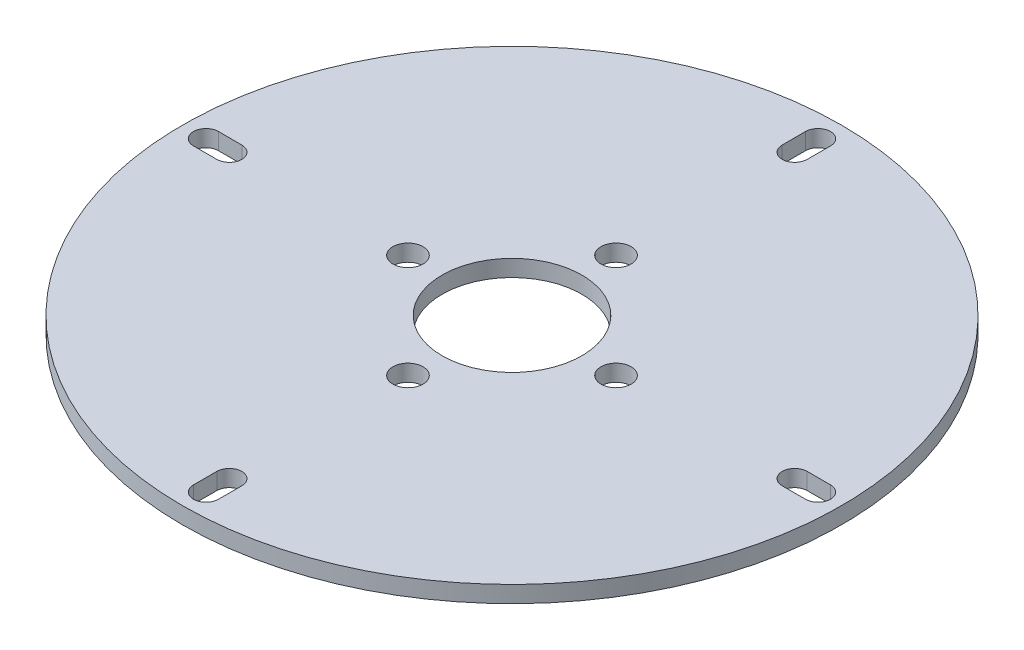
ISO-10303-21;
HEADER;
FILE_DESCRIPTION(('STEP AP214'),'2;1');
FILE_NAME('part.step','',(''),(''),'','','');
FILE_SCHEMA(('AUTOMOTIVE_DESIGN { 1 0 10303 214 1 1 1 1 }'));
ENDSEC;
DATA;
#1=APPLICATION_CONTEXT('core data for automotive mechanical design processes');
#2=APPLICATION_PROTOCOL_DEFINITION('international standard','automotive_design',2000,#1);
#3=PRODUCT_CONTEXT('',#1,'mechanical');
#4=PRODUCT('Part','Part','',(#3));
#5=PRODUCT_RELATED_PRODUCT_CATEGORY('part','',(#4));
#6=PRODUCT_DEFINITION_FORMATION('','',#4);
#7=PRODUCT_DEFINITION_CONTEXT('part definition',#1,'design');
#8=PRODUCT_DEFINITION('design','',#6,#7);
#9=PRODUCT_DEFINITION_SHAPE('','',#8);
#10=(LENGTH_UNIT() NAMED_UNIT(*) SI_UNIT(.MILLI.,.METRE.));
#11=(NAMED_UNIT(*) PLANE_ANGLE_UNIT() SI_UNIT($,.RADIAN.));
#12=(NAMED_UNIT(*) SI_UNIT($,.STERADIAN.) SOLID_ANGLE_UNIT());
#13=UNCERTAINTY_MEASURE_WITH_UNIT(LENGTH_MEASURE(1.E-05),#10,'distance_accuracy_value','');
#14=(GEOMETRIC_REPRESENTATION_CONTEXT(3) GLOBAL_UNCERTAINTY_ASSIGNED_CONTEXT((#13)) GLOBAL_UNIT_ASSIGNED_CONTEXT((#10,
#11,#12)) REPRESENTATION_CONTEXT('',''));
#15=CARTESIAN_POINT('',(0.,0.,0.));
#16=DIRECTION('',(0.,0.,1.));
#17=DIRECTION('',(1.,0.,0.));
#18=AXIS2_PLACEMENT_3D('',#15,#16,#17);
#19=CARTESIAN_POINT('',(0.,6.35,0.));
#20=DIRECTION('',(0.,-1.,0.));
#21=DIRECTION('',(0.,0.,-1.));
#22=AXIS2_PLACEMENT_3D('',#19,#20,#21);
#23=CYLINDRICAL_SURFACE('',#22,125.73);
#24=CARTESIAN_POINT('',(0.,6.35,0.));
#25=DIRECTION('',(0.,1.,0.));
#26=DIRECTION('',(0.,0.,1.));
#27=AXIS2_PLACEMENT_3D('',#24,#25,#26);
#28=CIRCLE('',#27,125.73);
#29=CARTESIAN_POINT('',(0.,6.35,125.73));
#30=VERTEX_POINT('',#29);
#31=EDGE_CURVE('E11',#30,#30,#28,.T.);
#32=ORIENTED_EDGE('',*,*,#31,.F.);
#33=EDGE_LOOP('',(#32));
#34=FACE_BOUND('',#33,.T.);
#35=CARTESIAN_POINT('',(0.,0.,0.));
#36=DIRECTION('',(0.,1.,0.));
#37=DIRECTION('',(0.,0.,1.));
#38=AXIS2_PLACEMENT_3D('',#35,#36,#37);
#39=CIRCLE('',#38,125.73);
#40=CARTESIAN_POINT('',(0.,0.,125.73));
#41=VERTEX_POINT('',#40);
#42=EDGE_CURVE('E48',#41,#41,#39,.T.);
#43=ORIENTED_EDGE('',*,*,#42,.T.);
#44=EDGE_LOOP('',(#43));
#45=FACE_BOUND('',#44,.T.);
#46=ADVANCED_FACE('F45',(#34,#45),#23,.T.);
#47=CARTESIAN_POINT('',(0.,6.35,0.));
#48=DIRECTION('',(0.,1.,0.));
#49=DIRECTION('',(0.,0.,1.));
#50=AXIS2_PLACEMENT_3D('',#47,#48,#49);
#51=PLANE('',#50);
#52=CARTESIAN_POINT('',(4.92454214481776E-05,6.35,39.6874999999886));
#53=DIRECTION('',(0.,1.,0.));
#54=DIRECTION('',(0.,0.,1.));
#55=AXIS2_PLACEMENT_3D('',#52,#53,#54);
#56=CIRCLE('',#55,5.7546875);
#57=CARTESIAN_POINT('',(4.92454214481776E-05,6.35,45.4421874999886));
#58=VERTEX_POINT('',#57);
#59=EDGE_CURVE('E309',#58,#58,#56,.T.);
#60=ORIENTED_EDGE('',*,*,#59,.F.);
#61=EDGE_LOOP('',(#60));
#62=FACE_BOUND('',#61,.T.);
#63=CARTESIAN_POINT('',(39.6875492454215,6.35,-1.09915874145494E-11));
#64=DIRECTION('',(0.,1.,0.));
#65=DIRECTION('',(0.,0.,1.));
#66=AXIS2_PLACEMENT_3D('',#63,#64,#65);
#67=CIRCLE('',#66,5.7546875);
#68=CARTESIAN_POINT('',(39.6875492454215,6.35,5.75468749998901));
#69=VERTEX_POINT('',#68);
#70=EDGE_CURVE('E300',#69,#69,#67,.T.);
#71=ORIENTED_EDGE('',*,*,#70,.F.);
#72=EDGE_LOOP('',(#71));
#73=FACE_BOUND('',#72,.T.);
#74=CARTESIAN_POINT('',(0.,6.35,0.));
#75=DIRECTION('',(0.,1.,0.));
#76=DIRECTION('',(0.,0.,1.));
#77=AXIS2_PLACEMENT_3D('',#74,#75,#76);
#78=CIRCLE('',#77,26.67);
#79=CARTESIAN_POINT('',(0.,6.35,26.67));
#80=VERTEX_POINT('',#79);
#81=EDGE_CURVE('E329',#80,#80,#78,.T.);
#82=ORIENTED_EDGE('',*,*,#81,.F.);
#83=EDGE_LOOP('',(#82));
#84=FACE_BOUND('',#83,.T.);
#85=CARTESIAN_POINT('',(0.,6.35,-107.85348));
#86=DIRECTION('',(0.,1.,0.));
#87=DIRECTION('',(0.,0.,1.));
#88=AXIS2_PLACEMENT_3D('',#85,#86,#87);
#89=CIRCLE('',#88,4.7625);
#90=CARTESIAN_POINT('',(-4.7625,6.35,-107.85348));
#91=VERTEX_POINT('',#90);
#92=CARTESIAN_POINT('',(4.7625,6.35,-107.85348));
#93=VERTEX_POINT('',#92);
#94=EDGE_CURVE('E60',#91,#93,#89,.T.);
#95=ORIENTED_EDGE('',*,*,#94,.F.);
#96=DIRECTION('',(0.,0.,1.));
#97=VECTOR('',#96,1.);
#98=CARTESIAN_POINT('',(-4.7625,6.35,-107.85348));
#99=LINE('',#98,#97);
#100=CARTESIAN_POINT('',(-4.7625,6.35,-116.74348));
#101=VERTEX_POINT('',#100);
#102=EDGE_CURVE('E330',#101,#91,#99,.T.);
#103=ORIENTED_EDGE('',*,*,#102,.F.);
#104=CARTESIAN_POINT('',(0.,6.35,-116.74348));
#105=DIRECTION('',(0.,1.,0.));
#106=DIRECTION('',(0.,0.,1.));
#107=AXIS2_PLACEMENT_3D('',#104,#105,#106);
#108=CIRCLE('',#107,4.7625);
#109=CARTESIAN_POINT('',(4.7625,6.35,-116.74348));
#110=VERTEX_POINT('',#109);
#111=EDGE_CURVE('E334',#110,#101,#108,.T.);
#112=ORIENTED_EDGE('',*,*,#111,.F.);
#113=DIRECTION('',(0.,0.,-1.));
#114=VECTOR('',#113,1.);
#115=CARTESIAN_POINT('',(4.7625,6.35,-107.85348));
#116=LINE('',#115,#114);
#117=EDGE_CURVE('E339',#93,#110,#116,.T.);
#118=ORIENTED_EDGE('',*,*,#117,.F.);
#119=EDGE_LOOP('',(#95,#103,#112,#118));
#120=FACE_BOUND('',#119,.T.);
#121=CARTESIAN_POINT('',(-107.853430754553,6.35,4.92454249330034E-05));
#122=DIRECTION('',(0.,1.,0.));
#123=DIRECTION('',(0.,0.,1.));
#124=AXIS2_PLACEMENT_3D('',#121,#122,#123);
#125=CIRCLE('',#124,4.7625);
#126=CARTESIAN_POINT('',(-107.853430754553,6.35,4.76254924542493));
#127=VERTEX_POINT('',#126);
#128=CARTESIAN_POINT('',(-107.853430754553,6.35,-4.76245075457507));
#129=VERTEX_POINT('',#128);
#130=EDGE_CURVE('E68',#127,#129,#125,.T.);
#131=ORIENTED_EDGE('',*,*,#130,.F.);
#132=DIRECTION('',(1.,0.,0.));
#133=VECTOR('',#132,1.);
#134=CARTESIAN_POINT('',(-107.853430754553,6.35,4.76254924542493));
#135=LINE('',#134,#133);
#136=CARTESIAN_POINT('',(-116.743430754553,6.35,4.76254924542493));
#137=VERTEX_POINT('',#136);
#138=EDGE_CURVE('E222',#137,#127,#135,.T.);
#139=ORIENTED_EDGE('',*,*,#138,.F.);
#140=CARTESIAN_POINT('',(-116.743430754553,6.35,4.92454249020663E-05));
#141=DIRECTION('',(0.,1.,0.));
#142=DIRECTION('',(0.,0.,1.));
#143=AXIS2_PLACEMENT_3D('',#140,#141,#142);
#144=CIRCLE('',#143,4.7625);
#145=CARTESIAN_POINT('',(-116.743430754553,6.35,-4.7624507545751));
#146=VERTEX_POINT('',#145);
#147=EDGE_CURVE('E226',#146,#137,#144,.T.);
#148=ORIENTED_EDGE('',*,*,#147,.F.);
#149=DIRECTION('',(-1.,0.,0.));
#150=VECTOR('',#149,1.);
#151=CARTESIAN_POINT('',(-107.853430754553,6.35,-4.76245075457507));
#152=LINE('',#151,#150);
#153=EDGE_CURVE('E231',#129,#146,#152,.T.);
#154=ORIENTED_EDGE('',*,*,#153,.F.);
#155=EDGE_LOOP('',(#131,#139,#148,#154));
#156=FACE_BOUND('',#155,.T.);
#157=CARTESIAN_POINT('',(9.8490871819328E-05,6.35,107.853479999978));
#158=DIRECTION('',(0.,1.,0.));
#159=DIRECTION('',(0.,0.,1.));
#160=AXIS2_PLACEMENT_3D('',#157,#158,#159);
#161=CIRCLE('',#160,4.7625);
#162=CARTESIAN_POINT('',(4.76259849087182,6.35,107.853479999978));
#163=VERTEX_POINT('',#162);
#164=CARTESIAN_POINT('',(-4.76240150912818,6.35,107.853479999978));
#165=VERTEX_POINT('',#164);
#166=EDGE_CURVE('E161',#163,#165,#161,.T.);
#167=ORIENTED_EDGE('',*,*,#166,.F.);
#168=DIRECTION('',(0.,0.,-1.));
#169=VECTOR('',#168,1.);
#170=CARTESIAN_POINT('',(4.76259849087182,6.35,107.853479999978));
#171=LINE('',#170,#169);
#172=CARTESIAN_POINT('',(4.76259849087182,6.35,116.743479999978));
#173=VERTEX_POINT('',#172);
#174=EDGE_CURVE('E172',#173,#163,#171,.T.);
#175=ORIENTED_EDGE('',*,*,#174,.F.);
#176=CARTESIAN_POINT('',(9.84908718201045E-05,6.35,116.743479999978));
#177=DIRECTION('',(0.,1.,0.));
#178=DIRECTION('',(0.,0.,1.));
#179=AXIS2_PLACEMENT_3D('',#176,#177,#178);
#180=CIRCLE('',#179,4.7625);
#181=CARTESIAN_POINT('',(-4.76240150912818,6.35,116.743479999978));
#182=VERTEX_POINT('',#181);
#183=EDGE_CURVE('E178',#182,#173,#180,.T.);
#184=ORIENTED_EDGE('',*,*,#183,.F.);
#185=DIRECTION('',(0.,0.,1.));
#186=VECTOR('',#185,1.);
#187=CARTESIAN_POINT('',(-4.76240150912818,6.35,107.853479999978));
#188=LINE('',#187,#186);
#189=EDGE_CURVE('E184',#165,#182,#188,.T.);
#190=ORIENTED_EDGE('',*,*,#189,.F.);
#191=EDGE_LOOP('',(#167,#175,#184,#190));
#192=FACE_BOUND('',#191,.T.);
#193=CARTESIAN_POINT('',(107.853529245425,6.35,-4.92454468731164E-05));
#194=DIRECTION('',(0.,1.,0.));
#195=DIRECTION('',(0.,0.,1.));
#196=AXIS2_PLACEMENT_3D('',#193,#194,#195);
#197=CIRCLE('',#196,4.7625);
#198=CARTESIAN_POINT('',(107.853529245425,6.35,-4.7625492454469));
#199=VERTEX_POINT('',#198);
#200=CARTESIAN_POINT('',(107.853529245425,6.35,4.7624507545531));
#201=VERTEX_POINT('',#200);
#202=EDGE_CURVE('E260',#199,#201,#197,.T.);
#203=ORIENTED_EDGE('',*,*,#202,.F.);
#204=DIRECTION('',(-1.,0.,0.));
#205=VECTOR('',#204,1.);
#206=CARTESIAN_POINT('',(107.853529245425,6.35,-4.7625492454469));
#207=LINE('',#206,#205);
#208=CARTESIAN_POINT('',(116.743529245425,6.35,-4.7625492454469));
#209=VERTEX_POINT('',#208);
#210=EDGE_CURVE('E271',#209,#199,#207,.T.);
#211=ORIENTED_EDGE('',*,*,#210,.F.);
#212=CARTESIAN_POINT('',(116.743529245425,6.35,-4.92454469012873E-05));
#213=DIRECTION('',(0.,1.,0.));
#214=DIRECTION('',(0.,0.,1.));
#215=AXIS2_PLACEMENT_3D('',#212,#213,#214);
#216=CIRCLE('',#215,4.7625);
#217=CARTESIAN_POINT('',(116.743529245425,6.35,4.7624507545531));
#218=VERTEX_POINT('',#217);
#219=EDGE_CURVE('E275',#218,#209,#216,.T.);
#220=ORIENTED_EDGE('',*,*,#219,.F.);
#221=DIRECTION('',(1.,0.,0.));
#222=VECTOR('',#221,1.);
#223=CARTESIAN_POINT('',(107.853529245425,6.35,4.7624507545531));
#224=LINE('',#223,#222);
#225=EDGE_CURVE('E280',#201,#218,#224,.T.);
#226=ORIENTED_EDGE('',*,*,#225,.F.);
#227=EDGE_LOOP('',(#203,#211,#220,#226));
#228=FACE_BOUND('',#227,.T.);
#229=CARTESIAN_POINT('',(-39.6874507545781,6.35,-1.14397780108696E-11));
#230=DIRECTION('',(0.,1.,0.));
#231=DIRECTION('',(0.,0.,1.));
#232=AXIS2_PLACEMENT_3D('',#229,#230,#231);
#233=CIRCLE('',#232,5.7546875);
#234=CARTESIAN_POINT('',(-39.6874507545781,6.35,5.75468749998856));
#235=VERTEX_POINT('',#234);
#236=EDGE_CURVE('E251',#235,#235,#233,.T.);
#237=ORIENTED_EDGE('',*,*,#236,.F.);
#238=EDGE_LOOP('',(#237));
#239=FACE_BOUND('',#238,.T.);
#240=CARTESIAN_POINT('',(4.92454218963868E-05,6.35,-39.687500000011));
#241=DIRECTION('',(0.,1.,0.));
#242=DIRECTION('',(0.,0.,1.));
#243=AXIS2_PLACEMENT_3D('',#240,#241,#242);
#244=CIRCLE('',#243,5.7546875);
#245=CARTESIAN_POINT('',(4.92454218963868E-05,6.35,-33.932812500011));
#246=VERTEX_POINT('',#245);
#247=EDGE_CURVE('E345',#246,#246,#244,.T.);
#248=ORIENTED_EDGE('',*,*,#247,.F.);
#249=EDGE_LOOP('',(#248));
#250=FACE_BOUND('',#249,.T.);
#251=ORIENTED_EDGE('',*,*,#31,.T.);
#252=EDGE_LOOP('',(#251));
#253=FACE_BOUND('',#252,.T.);
#254=ADVANCED_FACE('F181',(#62,#73,#84,#120,#156,#192,#228,#239,#250,#253),#51,.T.);
#255=CARTESIAN_POINT('',(0.,0.,0.));
#256=DIRECTION('',(0.,1.,0.));
#257=DIRECTION('',(0.,0.,1.));
#258=AXIS2_PLACEMENT_3D('',#255,#256,#257);
#259=PLANE('',#258);
#260=CARTESIAN_POINT('',(4.92454214481776E-05,0.,39.6874999999886));
#261=DIRECTION('',(0.,1.,0.));
#262=DIRECTION('',(0.,0.,1.));
#263=AXIS2_PLACEMENT_3D('',#260,#261,#262);
#264=CIRCLE('',#263,5.7546875);
#265=CARTESIAN_POINT('',(4.92454214481776E-05,0.,45.4421874999886));
#266=VERTEX_POINT('',#265);
#267=EDGE_CURVE('E255',#266,#266,#264,.T.);
#268=ORIENTED_EDGE('',*,*,#267,.T.);
#269=EDGE_LOOP('',(#268));
#270=FACE_BOUND('',#269,.T.);
#271=CARTESIAN_POINT('',(39.6875492454215,0.,-1.09915874145494E-11));
#272=DIRECTION('',(0.,1.,0.));
#273=DIRECTION('',(0.,0.,1.));
#274=AXIS2_PLACEMENT_3D('',#271,#272,#273);
#275=CIRCLE('',#274,5.7546875);
#276=CARTESIAN_POINT('',(39.6875492454215,0.,5.75468749998901));
#277=VERTEX_POINT('',#276);
#278=EDGE_CURVE('E305',#277,#277,#275,.T.);
#279=ORIENTED_EDGE('',*,*,#278,.T.);
#280=EDGE_LOOP('',(#279));
#281=FACE_BOUND('',#280,.T.);
#282=CARTESIAN_POINT('',(0.,0.,0.));
#283=DIRECTION('',(0.,1.,0.));
#284=DIRECTION('',(0.,0.,1.));
#285=AXIS2_PLACEMENT_3D('',#282,#283,#284);
#286=CIRCLE('',#285,26.67);
#287=CARTESIAN_POINT('',(0.,0.,26.67));
#288=VERTEX_POINT('',#287);
#289=EDGE_CURVE('E304',#288,#288,#286,.T.);
#290=ORIENTED_EDGE('',*,*,#289,.T.);
#291=EDGE_LOOP('',(#290));
#292=FACE_BOUND('',#291,.T.);
#293=DIRECTION('',(0.,0.,1.));
#294=VECTOR('',#293,1.);
#295=CARTESIAN_POINT('',(-4.7625,0.,-107.85348));
#296=LINE('',#295,#294);
#297=CARTESIAN_POINT('',(-4.7625,0.,-116.74348));
#298=VERTEX_POINT('',#297);
#299=CARTESIAN_POINT('',(-4.7625,0.,-107.85348));
#300=VERTEX_POINT('',#299);
#301=EDGE_CURVE('E319',#298,#300,#296,.T.);
#302=ORIENTED_EDGE('',*,*,#301,.T.);
#303=CARTESIAN_POINT('',(0.,0.,-107.85348));
#304=DIRECTION('',(0.,1.,0.));
#305=DIRECTION('',(0.,0.,1.));
#306=AXIS2_PLACEMENT_3D('',#303,#304,#305);
#307=CIRCLE('',#306,4.7625);
#308=CARTESIAN_POINT('',(4.7625,0.,-107.85348));
#309=VERTEX_POINT('',#308);
#310=EDGE_CURVE('E335',#300,#309,#307,.T.);
#311=ORIENTED_EDGE('',*,*,#310,.T.);
#312=DIRECTION('',(0.,0.,-1.));
#313=VECTOR('',#312,1.);
#314=CARTESIAN_POINT('',(4.7625,0.,-107.85348));
#315=LINE('',#314,#313);
#316=CARTESIAN_POINT('',(4.7625,0.,-116.74348));
#317=VERTEX_POINT('',#316);
#318=EDGE_CURVE('E353',#309,#317,#315,.T.);
#319=ORIENTED_EDGE('',*,*,#318,.T.);
#320=CARTESIAN_POINT('',(0.,0.,-116.74348));
#321=DIRECTION('',(0.,1.,0.));
#322=DIRECTION('',(0.,0.,1.));
#323=AXIS2_PLACEMENT_3D('',#320,#321,#322);
#324=CIRCLE('',#323,4.7625);
#325=EDGE_CURVE('E349',#317,#298,#324,.T.);
#326=ORIENTED_EDGE('',*,*,#325,.T.);
#327=EDGE_LOOP('',(#302,#311,#319,#326));
#328=FACE_BOUND('',#327,.T.);
#329=DIRECTION('',(1.,0.,0.));
#330=VECTOR('',#329,1.);
#331=CARTESIAN_POINT('',(-107.853430754553,0.,4.76254924542493));
#332=LINE('',#331,#330);
#333=CARTESIAN_POINT('',(-116.743430754553,0.,4.76254924542493));
#334=VERTEX_POINT('',#333);
#335=CARTESIAN_POINT('',(-107.853430754553,0.,4.76254924542493));
#336=VERTEX_POINT('',#335);
#337=EDGE_CURVE('E212',#334,#336,#332,.T.);
#338=ORIENTED_EDGE('',*,*,#337,.T.);
#339=CARTESIAN_POINT('',(-107.853430754553,0.,4.92454249330034E-05));
#340=DIRECTION('',(0.,1.,0.));
#341=DIRECTION('',(0.,0.,1.));
#342=AXIS2_PLACEMENT_3D('',#339,#340,#341);
#343=CIRCLE('',#342,4.7625);
#344=CARTESIAN_POINT('',(-107.853430754553,0.,-4.76245075457507));
#345=VERTEX_POINT('',#344);
#346=EDGE_CURVE('E227',#336,#345,#343,.T.);
#347=ORIENTED_EDGE('',*,*,#346,.T.);
#348=DIRECTION('',(-1.,0.,0.));
#349=VECTOR('',#348,1.);
#350=CARTESIAN_POINT('',(-107.853430754553,0.,-4.76245075457507));
#351=LINE('',#350,#349);
#352=CARTESIAN_POINT('',(-116.743430754553,0.,-4.76245075457507));
#353=VERTEX_POINT('',#352);
#354=EDGE_CURVE('E244',#345,#353,#351,.T.);
#355=ORIENTED_EDGE('',*,*,#354,.T.);
#356=CARTESIAN_POINT('',(-116.743430754553,0.,4.92454249020663E-05));
#357=DIRECTION('',(0.,1.,0.));
#358=DIRECTION('',(0.,0.,1.));
#359=AXIS2_PLACEMENT_3D('',#356,#357,#358);
#360=CIRCLE('',#359,4.7625);
#361=EDGE_CURVE('E240',#353,#334,#360,.T.);
#362=ORIENTED_EDGE('',*,*,#361,.T.);
#363=EDGE_LOOP('',(#338,#347,#355,#362));
#364=FACE_BOUND('',#363,.T.);
#365=DIRECTION('',(0.,0.,-1.));
#366=VECTOR('',#365,1.);
#367=CARTESIAN_POINT('',(4.76259849087182,0.,107.853479999978));
#368=LINE('',#367,#366);
#369=CARTESIAN_POINT('',(4.76259849087182,0.,116.743479999978));
#370=VERTEX_POINT('',#369);
#371=CARTESIAN_POINT('',(4.76259849087182,0.,107.853479999978));
#372=VERTEX_POINT('',#371);
#373=EDGE_CURVE('E195',#370,#372,#368,.T.);
#374=ORIENTED_EDGE('',*,*,#373,.T.);
#375=CARTESIAN_POINT('',(9.8490871819328E-05,0.,107.853479999978));
#376=DIRECTION('',(0.,1.,0.));
#377=DIRECTION('',(0.,0.,1.));
#378=AXIS2_PLACEMENT_3D('',#375,#376,#377);
#379=CIRCLE('',#378,4.7625);
#380=CARTESIAN_POINT('',(-4.76240150912818,0.,107.853479999978));
#381=VERTEX_POINT('',#380);
#382=EDGE_CURVE('E164',#372,#381,#379,.T.);
#383=ORIENTED_EDGE('',*,*,#382,.T.);
#384=DIRECTION('',(0.,0.,1.));
#385=VECTOR('',#384,1.);
#386=CARTESIAN_POINT('',(-4.76240150912818,0.,107.853479999978));
#387=LINE('',#386,#385);
#388=CARTESIAN_POINT('',(-4.76240150912818,0.,116.743479999978));
#389=VERTEX_POINT('',#388);
#390=EDGE_CURVE('E203',#381,#389,#387,.T.);
#391=ORIENTED_EDGE('',*,*,#390,.T.);
#392=CARTESIAN_POINT('',(9.84908718201045E-05,0.,116.743479999978));
#393=DIRECTION('',(0.,1.,0.));
#394=DIRECTION('',(0.,0.,1.));
#395=AXIS2_PLACEMENT_3D('',#392,#393,#394);
#396=CIRCLE('',#395,4.7625);
#397=EDGE_CURVE('E198',#389,#370,#396,.T.);
#398=ORIENTED_EDGE('',*,*,#397,.T.);
#399=EDGE_LOOP('',(#374,#383,#391,#398));
#400=FACE_BOUND('',#399,.T.);
#401=DIRECTION('',(-1.,0.,0.));
#402=VECTOR('',#401,1.);
#403=CARTESIAN_POINT('',(107.853529245425,0.,-4.7625492454469));
#404=LINE('',#403,#402);
#405=CARTESIAN_POINT('',(116.743529245425,0.,-4.7625492454469));
#406=VERTEX_POINT('',#405);
#407=CARTESIAN_POINT('',(107.853529245425,0.,-4.7625492454469));
#408=VERTEX_POINT('',#407);
#409=EDGE_CURVE('E265',#406,#408,#404,.T.);
#410=ORIENTED_EDGE('',*,*,#409,.T.);
#411=CARTESIAN_POINT('',(107.853529245425,0.,-4.92454468731164E-05));
#412=DIRECTION('',(0.,1.,0.));
#413=DIRECTION('',(0.,0.,1.));
#414=AXIS2_PLACEMENT_3D('',#411,#412,#413);
#415=CIRCLE('',#414,4.7625);
#416=CARTESIAN_POINT('',(107.853529245425,0.,4.7624507545531));
#417=VERTEX_POINT('',#416);
#418=EDGE_CURVE('E276',#408,#417,#415,.T.);
#419=ORIENTED_EDGE('',*,*,#418,.T.);
#420=DIRECTION('',(1.,0.,0.));
#421=VECTOR('',#420,1.);
#422=CARTESIAN_POINT('',(107.853529245425,0.,4.7624507545531));
#423=LINE('',#422,#421);
#424=CARTESIAN_POINT('',(116.743529245425,0.,4.7624507545531));
#425=VERTEX_POINT('',#424);
#426=EDGE_CURVE('E293',#417,#425,#423,.T.);
#427=ORIENTED_EDGE('',*,*,#426,.T.);
#428=CARTESIAN_POINT('',(116.743529245425,0.,-4.92454469012873E-05));
#429=DIRECTION('',(0.,1.,0.));
#430=DIRECTION('',(0.,0.,1.));
#431=AXIS2_PLACEMENT_3D('',#428,#429,#430);
#432=CIRCLE('',#431,4.7625);
#433=EDGE_CURVE('E289',#425,#406,#432,.T.);
#434=ORIENTED_EDGE('',*,*,#433,.T.);
#435=EDGE_LOOP('',(#410,#419,#427,#434));
#436=FACE_BOUND('',#435,.T.);
#437=CARTESIAN_POINT('',(-39.6874507545781,0.,-1.14397780108696E-11));
#438=DIRECTION('',(0.,1.,0.));
#439=DIRECTION('',(0.,0.,1.));
#440=AXIS2_PLACEMENT_3D('',#437,#438,#439);
#441=CIRCLE('',#440,5.7546875);
#442=CARTESIAN_POINT('',(-39.6874507545781,0.,5.75468749998856));
#443=VERTEX_POINT('',#442);
#444=EDGE_CURVE('E256',#443,#443,#441,.T.);
#445=ORIENTED_EDGE('',*,*,#444,.T.);
#446=EDGE_LOOP('',(#445));
#447=FACE_BOUND('',#446,.T.);
#448=CARTESIAN_POINT('',(4.92454218963868E-05,0.,-39.687500000011));
#449=DIRECTION('',(0.,1.,0.));
#450=DIRECTION('',(0.,0.,1.));
#451=AXIS2_PLACEMENT_3D('',#448,#449,#450);
#452=CIRCLE('',#451,5.7546875);
#453=CARTESIAN_POINT('',(4.92454218963868E-05,0.,-33.932812500011));
#454=VERTEX_POINT('',#453);
#455=EDGE_CURVE('E366',#454,#454,#452,.T.);
#456=ORIENTED_EDGE('',*,*,#455,.T.);
#457=EDGE_LOOP('',(#456));
#458=FACE_BOUND('',#457,.T.);
#459=ORIENTED_EDGE('',*,*,#42,.F.);
#460=EDGE_LOOP('',(#459));
#461=FACE_BOUND('',#460,.T.);
#462=ADVANCED_FACE('F378',(#270,#281,#292,#328,#364,#400,#436,#447,#458,#461),#259,.F.);
#463=CARTESIAN_POINT('',(4.92454218963868E-05,0.,-39.687500000011));
#464=DIRECTION('',(0.,1.,0.));
#465=DIRECTION('',(0.,0.,1.));
#466=AXIS2_PLACEMENT_3D('',#463,#464,#465);
#467=CYLINDRICAL_SURFACE('',#466,5.7546875);
#468=ORIENTED_EDGE('',*,*,#455,.F.);
#469=EDGE_LOOP('',(#468));
#470=FACE_BOUND('',#469,.T.);
#471=ORIENTED_EDGE('',*,*,#247,.T.);
#472=EDGE_LOOP('',(#471));
#473=FACE_BOUND('',#472,.T.);
#474=ADVANCED_FACE('F374',(#470,#473),#467,.F.);
#475=CARTESIAN_POINT('',(-39.6874507545781,0.,-1.14397780108696E-11));
#476=DIRECTION('',(0.,1.,0.));
#477=DIRECTION('',(0.,0.,1.));
#478=AXIS2_PLACEMENT_3D('',#475,#476,#477);
#479=CYLINDRICAL_SURFACE('',#478,5.7546875);
#480=ORIENTED_EDGE('',*,*,#444,.F.);
#481=EDGE_LOOP('',(#480));
#482=FACE_BOUND('',#481,.T.);
#483=ORIENTED_EDGE('',*,*,#236,.T.);
#484=EDGE_LOOP('',(#483));
#485=FACE_BOUND('',#484,.T.);
#486=ADVANCED_FACE('F394',(#482,#485),#479,.F.);
#487=CARTESIAN_POINT('',(107.853529245425,0.,-4.92454468731164E-05));
#488=DIRECTION('',(0.,1.,0.));
#489=DIRECTION('',(0.,0.,1.));
#490=AXIS2_PLACEMENT_3D('',#487,#488,#489);
#491=CYLINDRICAL_SURFACE('',#490,4.7625);
#492=ORIENTED_EDGE('',*,*,#202,.T.);
#493=DIRECTION('',(0.,1.,0.));
#494=VECTOR('',#493,1.);
#495=CARTESIAN_POINT('',(107.853529245425,0.,4.7624507545531));
#496=LINE('',#495,#494);
#497=EDGE_CURVE('E261',#417,#201,#496,.T.);
#498=ORIENTED_EDGE('',*,*,#497,.F.);
#499=ORIENTED_EDGE('',*,*,#418,.F.);
#500=DIRECTION('',(0.,1.,0.));
#501=VECTOR('',#500,1.);
#502=CARTESIAN_POINT('',(107.853529245425,0.,-4.7625492454469));
#503=LINE('',#502,#501);
#504=EDGE_CURVE('E186',#408,#199,#503,.T.);
#505=ORIENTED_EDGE('',*,*,#504,.T.);
#506=EDGE_LOOP('',(#492,#498,#499,#505));
#507=FACE_BOUND('',#506,.T.);
#508=ADVANCED_FACE('F431',(#507),#491,.F.);
#509=CARTESIAN_POINT('',(107.853529245425,0.,-4.7625492454469));
#510=DIRECTION('',(0.,0.,-1.));
#511=DIRECTION('',(-1.,0.,0.));
#512=AXIS2_PLACEMENT_3D('',#509,#510,#511);
#513=PLANE('',#512);
#514=ORIENTED_EDGE('',*,*,#210,.T.);
#515=ORIENTED_EDGE('',*,*,#504,.F.);
#516=ORIENTED_EDGE('',*,*,#409,.F.);
#517=DIRECTION('',(0.,1.,0.));
#518=VECTOR('',#517,1.);
#519=CARTESIAN_POINT('',(116.743529245425,0.,-4.7625492454469));
#520=LINE('',#519,#518);
#521=EDGE_CURVE('E190',#406,#209,#520,.T.);
#522=ORIENTED_EDGE('',*,*,#521,.T.);
#523=EDGE_LOOP('',(#514,#515,#516,#522));
#524=FACE_BOUND('',#523,.T.);
#525=ADVANCED_FACE('F427',(#524),#513,.F.);
#526=CARTESIAN_POINT('',(116.743529245425,0.,-4.92454469012873E-05));
#527=DIRECTION('',(0.,1.,0.));
#528=DIRECTION('',(0.,0.,1.));
#529=AXIS2_PLACEMENT_3D('',#526,#527,#528);
#530=CYLINDRICAL_SURFACE('',#529,4.7625);
#531=ORIENTED_EDGE('',*,*,#219,.T.);
#532=ORIENTED_EDGE('',*,*,#521,.F.);
#533=ORIENTED_EDGE('',*,*,#433,.F.);
#534=DIRECTION('',(0.,1.,0.));
#535=VECTOR('',#534,1.);
#536=CARTESIAN_POINT('',(116.743529245425,0.,4.7624507545531));
#537=LINE('',#536,#535);
#538=EDGE_CURVE('E266',#425,#218,#537,.T.);
#539=ORIENTED_EDGE('',*,*,#538,.T.);
#540=EDGE_LOOP('',(#531,#532,#533,#539));
#541=FACE_BOUND('',#540,.T.);
#542=ADVANCED_FACE('F430',(#541),#530,.F.);
#543=CARTESIAN_POINT('',(107.853529245425,0.,4.7624507545531));
#544=DIRECTION('',(0.,0.,1.));
#545=DIRECTION('',(1.,0.,0.));
#546=AXIS2_PLACEMENT_3D('',#543,#544,#545);
#547=PLANE('',#546);
#548=ORIENTED_EDGE('',*,*,#225,.T.);
#549=ORIENTED_EDGE('',*,*,#538,.F.);
#550=ORIENTED_EDGE('',*,*,#426,.F.);
#551=ORIENTED_EDGE('',*,*,#497,.T.);
#552=EDGE_LOOP('',(#548,#549,#550,#551));
#553=FACE_BOUND('',#552,.T.);
#554=ADVANCED_FACE('F435',(#553),#547,.F.);
#555=CARTESIAN_POINT('',(9.8490871819328E-05,0.,107.853479999978));
#556=DIRECTION('',(0.,1.,0.));
#557=DIRECTION('',(0.,0.,1.));
#558=AXIS2_PLACEMENT_3D('',#555,#556,#557);
#559=CYLINDRICAL_SURFACE('',#558,4.7625);
#560=ORIENTED_EDGE('',*,*,#166,.T.);
#561=DIRECTION('',(0.,1.,0.));
#562=VECTOR('',#561,1.);
#563=CARTESIAN_POINT('',(-4.76240150912818,0.,107.853479999978));
#564=LINE('',#563,#562);
#565=EDGE_CURVE('E199',#381,#165,#564,.T.);
#566=ORIENTED_EDGE('',*,*,#565,.F.);
#567=ORIENTED_EDGE('',*,*,#382,.F.);
#568=DIRECTION('',(0.,1.,0.));
#569=VECTOR('',#568,1.);
#570=CARTESIAN_POINT('',(4.76259849087182,0.,107.853479999978));
#571=LINE('',#570,#569);
#572=EDGE_CURVE('E157',#372,#163,#571,.T.);
#573=ORIENTED_EDGE('',*,*,#572,.T.);
#574=EDGE_LOOP('',(#560,#566,#567,#573));
#575=FACE_BOUND('',#574,.T.);
#576=ADVANCED_FACE('F159',(#575),#559,.F.);
#577=CARTESIAN_POINT('',(4.76259849087182,0.,107.853479999978));
#578=DIRECTION('',(1.,0.,0.));
#579=DIRECTION('',(0.,0.,-1.));
#580=AXIS2_PLACEMENT_3D('',#577,#578,#579);
#581=PLANE('',#580);
#582=ORIENTED_EDGE('',*,*,#174,.T.);
#583=ORIENTED_EDGE('',*,*,#572,.F.);
#584=ORIENTED_EDGE('',*,*,#373,.F.);
#585=DIRECTION('',(0.,1.,0.));
#586=VECTOR('',#585,1.);
#587=CARTESIAN_POINT('',(4.76259849087182,0.,116.743479999978));
#588=LINE('',#587,#586);
#589=EDGE_CURVE('E169',#370,#173,#588,.T.);
#590=ORIENTED_EDGE('',*,*,#589,.T.);
#591=EDGE_LOOP('',(#582,#583,#584,#590));
#592=FACE_BOUND('',#591,.T.);
#593=ADVANCED_FACE('F173',(#592),#581,.F.);
#594=CARTESIAN_POINT('',(9.84908718201045E-05,0.,116.743479999978));
#595=DIRECTION('',(0.,1.,0.));
#596=DIRECTION('',(0.,0.,1.));
#597=AXIS2_PLACEMENT_3D('',#594,#595,#596);
#598=CYLINDRICAL_SURFACE('',#597,4.7625);
#599=ORIENTED_EDGE('',*,*,#183,.T.);
#600=ORIENTED_EDGE('',*,*,#589,.F.);
#601=ORIENTED_EDGE('',*,*,#397,.F.);
#602=DIRECTION('',(0.,1.,0.));
#603=VECTOR('',#602,1.);
#604=CARTESIAN_POINT('',(-4.76240150912818,0.,116.743479999978));
#605=LINE('',#604,#603);
#606=EDGE_CURVE('E615',#389,#182,#605,.T.);
#607=ORIENTED_EDGE('',*,*,#606,.T.);
#608=EDGE_LOOP('',(#599,#600,#601,#607));
#609=FACE_BOUND('',#608,.T.);
#610=ADVANCED_FACE('F463',(#609),#598,.F.);
#611=CARTESIAN_POINT('',(-4.76240150912818,0.,107.853479999978));
#612=DIRECTION('',(-1.,0.,0.));
#613=DIRECTION('',(0.,0.,1.));
#614=AXIS2_PLACEMENT_3D('',#611,#612,#613);
#615=PLANE('',#614);
#616=ORIENTED_EDGE('',*,*,#189,.T.);
#617=ORIENTED_EDGE('',*,*,#606,.F.);
#618=ORIENTED_EDGE('',*,*,#390,.F.);
#619=ORIENTED_EDGE('',*,*,#565,.T.);
#620=EDGE_LOOP('',(#616,#617,#618,#619));
#621=FACE_BOUND('',#620,.T.);
#622=ADVANCED_FACE('F460',(#621),#615,.F.);
#623=CARTESIAN_POINT('',(-107.853430754553,0.,4.92454249330034E-05));
#624=DIRECTION('',(0.,1.,0.));
#625=DIRECTION('',(0.,0.,1.));
#626=AXIS2_PLACEMENT_3D('',#623,#624,#625);
#627=CYLINDRICAL_SURFACE('',#626,4.7625);
#628=ORIENTED_EDGE('',*,*,#130,.T.);
#629=DIRECTION('',(0.,1.,0.));
#630=VECTOR('',#629,1.);
#631=CARTESIAN_POINT('',(-107.853430754553,0.,-4.76245075457507));
#632=LINE('',#631,#630);
#633=EDGE_CURVE('E209',#345,#129,#632,.T.);
#634=ORIENTED_EDGE('',*,*,#633,.F.);
#635=ORIENTED_EDGE('',*,*,#346,.F.);
#636=DIRECTION('',(0.,1.,0.));
#637=VECTOR('',#636,1.);
#638=CARTESIAN_POINT('',(-107.853430754553,0.,4.76254924542493));
#639=LINE('',#638,#637);
#640=EDGE_CURVE('E219',#336,#127,#639,.T.);
#641=ORIENTED_EDGE('',*,*,#640,.T.);
#642=EDGE_LOOP('',(#628,#634,#635,#641));
#643=FACE_BOUND('',#642,.T.);
#644=ADVANCED_FACE('F450',(#643),#627,.F.);
#645=CARTESIAN_POINT('',(-107.853430754553,0.,4.76254924542493));
#646=DIRECTION('',(0.,0.,1.));
#647=DIRECTION('',(1.,0.,0.));
#648=AXIS2_PLACEMENT_3D('',#645,#646,#647);
#649=PLANE('',#648);
#650=ORIENTED_EDGE('',*,*,#138,.T.);
#651=ORIENTED_EDGE('',*,*,#640,.F.);
#652=ORIENTED_EDGE('',*,*,#337,.F.);
#653=DIRECTION('',(0.,1.,0.));
#654=VECTOR('',#653,1.);
#655=CARTESIAN_POINT('',(-116.743430754553,0.,4.76254924542493));
#656=LINE('',#655,#654);
#657=EDGE_CURVE('E216',#334,#137,#656,.T.);
#658=ORIENTED_EDGE('',*,*,#657,.T.);
#659=EDGE_LOOP('',(#650,#651,#652,#658));
#660=FACE_BOUND('',#659,.T.);
#661=ADVANCED_FACE('F446',(#660),#649,.F.);
#662=CARTESIAN_POINT('',(-116.743430754553,0.,4.92454249020663E-05));
#663=DIRECTION('',(0.,1.,0.));
#664=DIRECTION('',(0.,0.,1.));
#665=AXIS2_PLACEMENT_3D('',#662,#663,#664);
#666=CYLINDRICAL_SURFACE('',#665,4.7625);
#667=ORIENTED_EDGE('',*,*,#147,.T.);
#668=ORIENTED_EDGE('',*,*,#657,.F.);
#669=ORIENTED_EDGE('',*,*,#361,.F.);
#670=DIRECTION('',(0.,1.,0.));
#671=VECTOR('',#670,1.);
#672=CARTESIAN_POINT('',(-116.743430754553,0.,-4.7624507545751));
#673=LINE('',#672,#671);
#674=EDGE_CURVE('E213',#353,#146,#673,.T.);
#675=ORIENTED_EDGE('',*,*,#674,.T.);
#676=EDGE_LOOP('',(#667,#668,#669,#675));
#677=FACE_BOUND('',#676,.T.);
#678=ADVANCED_FACE('F449',(#677),#666,.F.);
#679=CARTESIAN_POINT('',(-107.853430754553,0.,-4.76245075457507));
#680=DIRECTION('',(0.,0.,-1.));
#681=DIRECTION('',(-1.,0.,0.));
#682=AXIS2_PLACEMENT_3D('',#679,#680,#681);
#683=PLANE('',#682);
#684=ORIENTED_EDGE('',*,*,#153,.T.);
#685=ORIENTED_EDGE('',*,*,#674,.F.);
#686=ORIENTED_EDGE('',*,*,#354,.F.);
#687=ORIENTED_EDGE('',*,*,#633,.T.);
#688=EDGE_LOOP('',(#684,#685,#686,#687));
#689=FACE_BOUND('',#688,.T.);
#690=ADVANCED_FACE('F419',(#689),#683,.F.);
#691=CARTESIAN_POINT('',(0.,0.,-107.85348));
#692=DIRECTION('',(0.,1.,0.));
#693=DIRECTION('',(0.,0.,1.));
#694=AXIS2_PLACEMENT_3D('',#691,#692,#693);
#695=CYLINDRICAL_SURFACE('',#694,4.7625);
#696=ORIENTED_EDGE('',*,*,#94,.T.);
#697=DIRECTION('',(0.,1.,0.));
#698=VECTOR('',#697,1.);
#699=CARTESIAN_POINT('',(4.7625,0.,-107.85348));
#700=LINE('',#699,#698);
#701=EDGE_CURVE('E316',#309,#93,#700,.T.);
#702=ORIENTED_EDGE('',*,*,#701,.F.);
#703=ORIENTED_EDGE('',*,*,#310,.F.);
#704=DIRECTION('',(0.,1.,0.));
#705=VECTOR('',#704,1.);
#706=CARTESIAN_POINT('',(-4.7625,0.,-107.85348));
#707=LINE('',#706,#705);
#708=EDGE_CURVE('E326',#300,#91,#707,.T.);
#709=ORIENTED_EDGE('',*,*,#708,.T.);
#710=EDGE_LOOP('',(#696,#702,#703,#709));
#711=FACE_BOUND('',#710,.T.);
#712=ADVANCED_FACE('F409',(#711),#695,.F.);
#713=CARTESIAN_POINT('',(-4.7625,0.,-107.85348));
#714=DIRECTION('',(-1.,0.,0.));
#715=DIRECTION('',(0.,0.,1.));
#716=AXIS2_PLACEMENT_3D('',#713,#714,#715);
#717=PLANE('',#716);
#718=ORIENTED_EDGE('',*,*,#102,.T.);
#719=ORIENTED_EDGE('',*,*,#708,.F.);
#720=ORIENTED_EDGE('',*,*,#301,.F.);
#721=DIRECTION('',(0.,1.,0.));
#722=VECTOR('',#721,1.);
#723=CARTESIAN_POINT('',(-4.7625,0.,-116.74348));
#724=LINE('',#723,#722);
#725=EDGE_CURVE('E323',#298,#101,#724,.T.);
#726=ORIENTED_EDGE('',*,*,#725,.T.);
#727=EDGE_LOOP('',(#718,#719,#720,#726));
#728=FACE_BOUND('',#727,.T.);
#729=ADVANCED_FACE('F405',(#728),#717,.F.);
#730=CARTESIAN_POINT('',(0.,0.,-116.74348));
#731=DIRECTION('',(0.,1.,0.));
#732=DIRECTION('',(0.,0.,1.));
#733=AXIS2_PLACEMENT_3D('',#730,#731,#732);
#734=CYLINDRICAL_SURFACE('',#733,4.7625);
#735=ORIENTED_EDGE('',*,*,#111,.T.);
#736=ORIENTED_EDGE('',*,*,#725,.F.);
#737=ORIENTED_EDGE('',*,*,#325,.F.);
#738=DIRECTION('',(0.,1.,0.));
#739=VECTOR('',#738,1.);
#740=CARTESIAN_POINT('',(4.7625,0.,-116.74348));
#741=LINE('',#740,#739);
#742=EDGE_CURVE('E320',#317,#110,#741,.T.);
#743=ORIENTED_EDGE('',*,*,#742,.T.);
#744=EDGE_LOOP('',(#735,#736,#737,#743));
#745=FACE_BOUND('',#744,.T.);
#746=ADVANCED_FACE('F408',(#745),#734,.F.);
#747=CARTESIAN_POINT('',(4.7625,0.,-107.85348));
#748=DIRECTION('',(1.,0.,0.));
#749=DIRECTION('',(0.,0.,-1.));
#750=AXIS2_PLACEMENT_3D('',#747,#748,#749);
#751=PLANE('',#750);
#752=ORIENTED_EDGE('',*,*,#117,.T.);
#753=ORIENTED_EDGE('',*,*,#742,.F.);
#754=ORIENTED_EDGE('',*,*,#318,.F.);
#755=ORIENTED_EDGE('',*,*,#701,.T.);
#756=EDGE_LOOP('',(#752,#753,#754,#755));
#757=FACE_BOUND('',#756,.T.);
#758=ADVANCED_FACE('F403',(#757),#751,.F.);
#759=CARTESIAN_POINT('',(0.,0.,0.));
#760=DIRECTION('',(0.,1.,0.));
#761=DIRECTION('',(0.,0.,1.));
#762=AXIS2_PLACEMENT_3D('',#759,#760,#761);
#763=CYLINDRICAL_SURFACE('',#762,26.67);
#764=ORIENTED_EDGE('',*,*,#289,.F.);
#765=EDGE_LOOP('',(#764));
#766=FACE_BOUND('',#765,.T.);
#767=ORIENTED_EDGE('',*,*,#81,.T.);
#768=EDGE_LOOP('',(#767));
#769=FACE_BOUND('',#768,.T.);
#770=ADVANCED_FACE('F399',(#766,#769),#763,.F.);
#771=CARTESIAN_POINT('',(39.6875492454215,0.,-1.09915874145494E-11));
#772=DIRECTION('',(0.,1.,0.));
#773=DIRECTION('',(0.,0.,1.));
#774=AXIS2_PLACEMENT_3D('',#771,#772,#773);
#775=CYLINDRICAL_SURFACE('',#774,5.7546875);
#776=ORIENTED_EDGE('',*,*,#278,.F.);
#777=EDGE_LOOP('',(#776));
#778=FACE_BOUND('',#777,.T.);
#779=ORIENTED_EDGE('',*,*,#70,.T.);
#780=EDGE_LOOP('',(#779));
#781=FACE_BOUND('',#780,.T.);
#782=ADVANCED_FACE('F402',(#778,#781),#775,.F.);
#783=CARTESIAN_POINT('',(4.92454214481776E-05,0.,39.6874999999886));
#784=DIRECTION('',(0.,1.,0.));
#785=DIRECTION('',(0.,0.,1.));
#786=AXIS2_PLACEMENT_3D('',#783,#784,#785);
#787=CYLINDRICAL_SURFACE('',#786,5.7546875);
#788=ORIENTED_EDGE('',*,*,#267,.F.);
#789=EDGE_LOOP('',(#788));
#790=FACE_BOUND('',#789,.T.);
#791=ORIENTED_EDGE('',*,*,#59,.T.);
#792=EDGE_LOOP('',(#791));
#793=FACE_BOUND('',#792,.T.);
#794=ADVANCED_FACE('F420',(#790,#793),#787,.F.);
#795=CLOSED_SHELL('',(#46,#254,#462,#474,#486,#508,#525,#542,#554,#576,#593,#610,#622,#644,#661,
#678,#690,#712,#729,#746,#758,#770,#782,#794));
#796=MANIFOLD_SOLID_BREP('B2',#795);
#797=ADVANCED_BREP_SHAPE_REPRESENTATION('',(#18,#796),#14);
#798=SHAPE_DEFINITION_REPRESENTATION(#9,#797);
ENDSEC;
END-ISO-10303-21;
